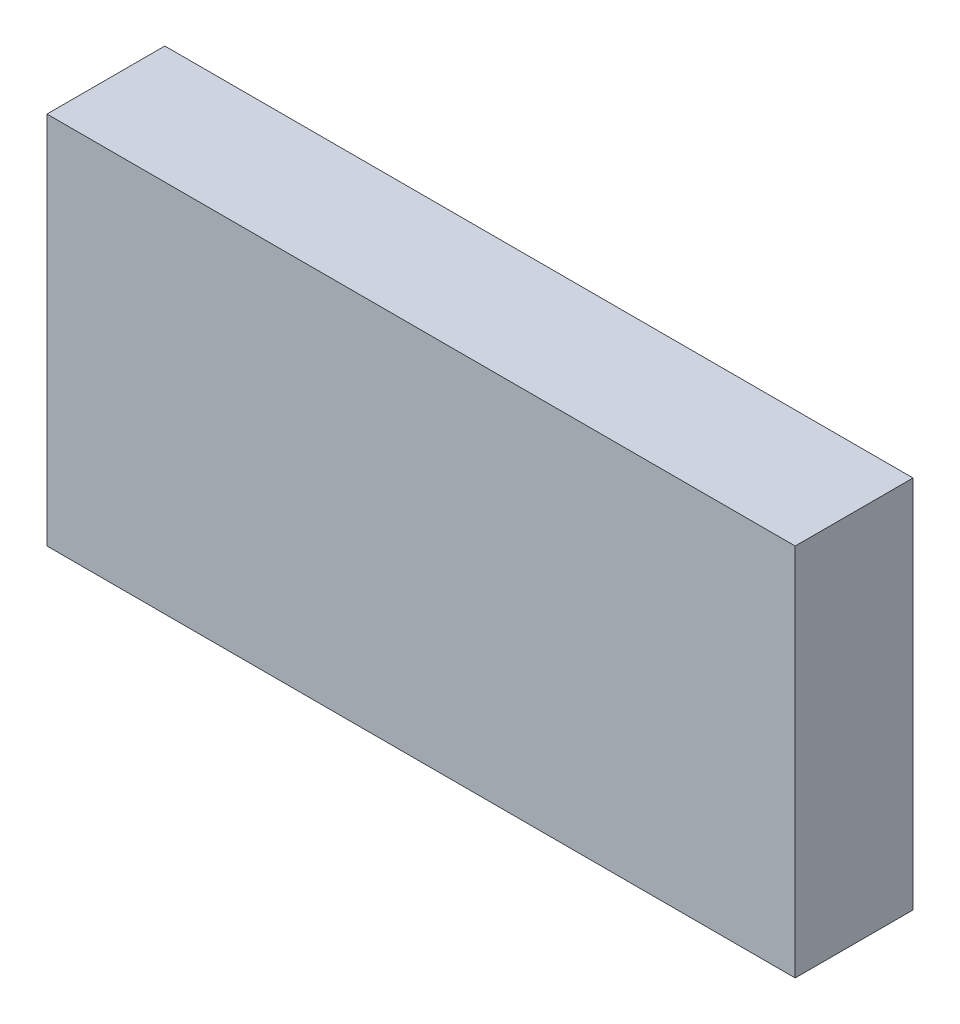
ISO-10303-21;
HEADER;
FILE_DESCRIPTION(('STEP AP214'),'2;1');
FILE_NAME('part.step','',(''),(''),'','','');
FILE_SCHEMA(('AUTOMOTIVE_DESIGN { 1 0 10303 214 1 1 1 1 }'));
ENDSEC;
DATA;
#1=APPLICATION_CONTEXT('core data for automotive mechanical design processes');
#2=APPLICATION_PROTOCOL_DEFINITION('international standard','automotive_design',2000,#1);
#3=PRODUCT_CONTEXT('',#1,'mechanical');
#4=PRODUCT('Part','Part','',(#3));
#5=PRODUCT_RELATED_PRODUCT_CATEGORY('part','',(#4));
#6=PRODUCT_DEFINITION_FORMATION('','',#4);
#7=PRODUCT_DEFINITION_CONTEXT('part definition',#1,'design');
#8=PRODUCT_DEFINITION('design','',#6,#7);
#9=PRODUCT_DEFINITION_SHAPE('','',#8);
#10=(LENGTH_UNIT() NAMED_UNIT(*) SI_UNIT(.MILLI.,.METRE.));
#11=(NAMED_UNIT(*) PLANE_ANGLE_UNIT() SI_UNIT($,.RADIAN.));
#12=(NAMED_UNIT(*) SI_UNIT($,.STERADIAN.) SOLID_ANGLE_UNIT());
#13=UNCERTAINTY_MEASURE_WITH_UNIT(LENGTH_MEASURE(1.E-05),#10,'distance_accuracy_value','');
#14=(GEOMETRIC_REPRESENTATION_CONTEXT(3) GLOBAL_UNCERTAINTY_ASSIGNED_CONTEXT((#13)) GLOBAL_UNIT_ASSIGNED_CONTEXT((#10,
#11,#12)) REPRESENTATION_CONTEXT('',''));
#15=CARTESIAN_POINT('',(0.,0.,0.));
#16=DIRECTION('',(0.,0.,1.));
#17=DIRECTION('',(1.,0.,0.));
#18=AXIS2_PLACEMENT_3D('',#15,#16,#17);
#19=CARTESIAN_POINT('',(0.,0.,-6.3));
#20=DIRECTION('',(-1.,0.,0.));
#21=DIRECTION('',(0.,0.,1.));
#22=AXIS2_PLACEMENT_3D('',#19,#20,#21);
#23=PLANE('',#22);
#24=DIRECTION('',(0.,-1.,0.));
#25=VECTOR('',#24,1.);
#26=CARTESIAN_POINT('',(0.,0.,0.));
#27=LINE('',#26,#25);
#28=CARTESIAN_POINT('',(0.,20.,0.));
#29=VERTEX_POINT('',#28);
#30=CARTESIAN_POINT('',(0.,0.,0.));
#31=VERTEX_POINT('',#30);
#32=EDGE_CURVE('E107',#29,#31,#27,.T.);
#33=ORIENTED_EDGE('',*,*,#32,.F.);
#34=DIRECTION('',(0.,0.,1.));
#35=VECTOR('',#34,1.);
#36=CARTESIAN_POINT('',(0.,20.,-6.3));
#37=LINE('',#36,#35);
#38=CARTESIAN_POINT('',(0.,20.,-6.3));
#39=VERTEX_POINT('',#38);
#40=EDGE_CURVE('E11',#39,#29,#37,.T.);
#41=ORIENTED_EDGE('',*,*,#40,.F.);
#42=DIRECTION('',(0.,-1.,0.));
#43=VECTOR('',#42,1.);
#44=CARTESIAN_POINT('',(0.,0.,-6.3));
#45=LINE('',#44,#43);
#46=CARTESIAN_POINT('',(0.,0.,-6.3));
#47=VERTEX_POINT('',#46);
#48=EDGE_CURVE('E102',#39,#47,#45,.T.);
#49=ORIENTED_EDGE('',*,*,#48,.T.);
#50=DIRECTION('',(0.,0.,1.));
#51=VECTOR('',#50,1.);
#52=CARTESIAN_POINT('',(0.,0.,-6.3));
#53=LINE('',#52,#51);
#54=EDGE_CURVE('E46',#47,#31,#53,.T.);
#55=ORIENTED_EDGE('',*,*,#54,.T.);
#56=EDGE_LOOP('',(#33,#41,#49,#55));
#57=FACE_BOUND('',#56,.T.);
#58=ADVANCED_FACE('F43',(#57),#23,.T.);
#59=CARTESIAN_POINT('',(0.,20.,-6.3));
#60=DIRECTION('',(0.,1.,0.));
#61=DIRECTION('',(0.,0.,1.));
#62=AXIS2_PLACEMENT_3D('',#59,#60,#61);
#63=PLANE('',#62);
#64=DIRECTION('',(-1.,0.,0.));
#65=VECTOR('',#64,1.);
#66=CARTESIAN_POINT('',(0.,20.,0.));
#67=LINE('',#66,#65);
#68=CARTESIAN_POINT('',(40.,20.,0.));
#69=VERTEX_POINT('',#68);
#70=EDGE_CURVE('E104',#69,#29,#67,.T.);
#71=ORIENTED_EDGE('',*,*,#70,.F.);
#72=DIRECTION('',(0.,0.,1.));
#73=VECTOR('',#72,1.);
#74=CARTESIAN_POINT('',(40.,20.,-6.3));
#75=LINE('',#74,#73);
#76=CARTESIAN_POINT('',(40.,20.,-6.3));
#77=VERTEX_POINT('',#76);
#78=EDGE_CURVE('E55',#77,#69,#75,.T.);
#79=ORIENTED_EDGE('',*,*,#78,.F.);
#80=DIRECTION('',(-1.,0.,0.));
#81=VECTOR('',#80,1.);
#82=CARTESIAN_POINT('',(0.,20.,-6.3));
#83=LINE('',#82,#81);
#84=EDGE_CURVE('E97',#77,#39,#83,.T.);
#85=ORIENTED_EDGE('',*,*,#84,.T.);
#86=ORIENTED_EDGE('',*,*,#40,.T.);
#87=EDGE_LOOP('',(#71,#79,#85,#86));
#88=FACE_BOUND('',#87,.T.);
#89=ADVANCED_FACE('F117',(#88),#63,.T.);
#90=CARTESIAN_POINT('',(40.,0.,-6.3));
#91=DIRECTION('',(1.,0.,0.));
#92=DIRECTION('',(0.,0.,-1.));
#93=AXIS2_PLACEMENT_3D('',#90,#91,#92);
#94=PLANE('',#93);
#95=DIRECTION('',(0.,1.,0.));
#96=VECTOR('',#95,1.);
#97=CARTESIAN_POINT('',(40.,0.,0.));
#98=LINE('',#97,#96);
#99=CARTESIAN_POINT('',(40.,0.,0.));
#100=VERTEX_POINT('',#99);
#101=EDGE_CURVE('E93',#100,#69,#98,.T.);
#102=ORIENTED_EDGE('',*,*,#101,.F.);
#103=DIRECTION('',(0.,0.,1.));
#104=VECTOR('',#103,1.);
#105=CARTESIAN_POINT('',(40.,0.,-6.3));
#106=LINE('',#105,#104);
#107=CARTESIAN_POINT('',(40.,0.,-6.3));
#108=VERTEX_POINT('',#107);
#109=EDGE_CURVE('E88',#108,#100,#106,.T.);
#110=ORIENTED_EDGE('',*,*,#109,.F.);
#111=DIRECTION('',(0.,1.,0.));
#112=VECTOR('',#111,1.);
#113=CARTESIAN_POINT('',(40.,0.,-6.3));
#114=LINE('',#113,#112);
#115=EDGE_CURVE('E91',#108,#77,#114,.T.);
#116=ORIENTED_EDGE('',*,*,#115,.T.);
#117=ORIENTED_EDGE('',*,*,#78,.T.);
#118=EDGE_LOOP('',(#102,#110,#116,#117));
#119=FACE_BOUND('',#118,.T.);
#120=ADVANCED_FACE('F89',(#119),#94,.T.);
#121=CARTESIAN_POINT('',(0.,0.,-6.3));
#122=DIRECTION('',(0.,-1.,0.));
#123=DIRECTION('',(0.,0.,-1.));
#124=AXIS2_PLACEMENT_3D('',#121,#122,#123);
#125=PLANE('',#124);
#126=DIRECTION('',(1.,0.,0.));
#127=VECTOR('',#126,1.);
#128=CARTESIAN_POINT('',(0.,0.,0.));
#129=LINE('',#128,#127);
#130=EDGE_CURVE('E110',#31,#100,#129,.T.);
#131=ORIENTED_EDGE('',*,*,#130,.F.);
#132=ORIENTED_EDGE('',*,*,#54,.F.);
#133=DIRECTION('',(1.,0.,0.));
#134=VECTOR('',#133,1.);
#135=CARTESIAN_POINT('',(0.,0.,-6.3));
#136=LINE('',#135,#134);
#137=EDGE_CURVE('E100',#47,#108,#136,.T.);
#138=ORIENTED_EDGE('',*,*,#137,.T.);
#139=ORIENTED_EDGE('',*,*,#109,.T.);
#140=EDGE_LOOP('',(#131,#132,#138,#139));
#141=FACE_BOUND('',#140,.T.);
#142=ADVANCED_FACE('F99',(#141),#125,.T.);
#143=CARTESIAN_POINT('',(0.,0.,-6.3));
#144=DIRECTION('',(0.,0.,-1.));
#145=DIRECTION('',(-1.,0.,0.));
#146=AXIS2_PLACEMENT_3D('',#143,#144,#145);
#147=PLANE('',#146);
#148=ORIENTED_EDGE('',*,*,#48,.F.);
#149=ORIENTED_EDGE('',*,*,#84,.F.);
#150=ORIENTED_EDGE('',*,*,#115,.F.);
#151=ORIENTED_EDGE('',*,*,#137,.F.);
#152=EDGE_LOOP('',(#148,#149,#150,#151));
#153=FACE_BOUND('',#152,.T.);
#154=ADVANCED_FACE('F96',(#153),#147,.T.);
#155=CARTESIAN_POINT('',(0.,0.,0.));
#156=DIRECTION('',(0.,0.,-1.));
#157=DIRECTION('',(-1.,0.,0.));
#158=AXIS2_PLACEMENT_3D('',#155,#156,#157);
#159=PLANE('',#158);
#160=ORIENTED_EDGE('',*,*,#32,.T.);
#161=ORIENTED_EDGE('',*,*,#130,.T.);
#162=ORIENTED_EDGE('',*,*,#101,.T.);
#163=ORIENTED_EDGE('',*,*,#70,.T.);
#164=EDGE_LOOP('',(#160,#161,#162,#163));
#165=FACE_BOUND('',#164,.T.);
#166=ADVANCED_FACE('F116',(#165),#159,.F.);
#167=CLOSED_SHELL('',(#58,#89,#120,#142,#154,#166));
#168=MANIFOLD_SOLID_BREP('B2',#167);
#169=ADVANCED_BREP_SHAPE_REPRESENTATION('',(#18,#168),#14);
#170=SHAPE_DEFINITION_REPRESENTATION(#9,#169);
ENDSEC;
END-ISO-10303-21;
